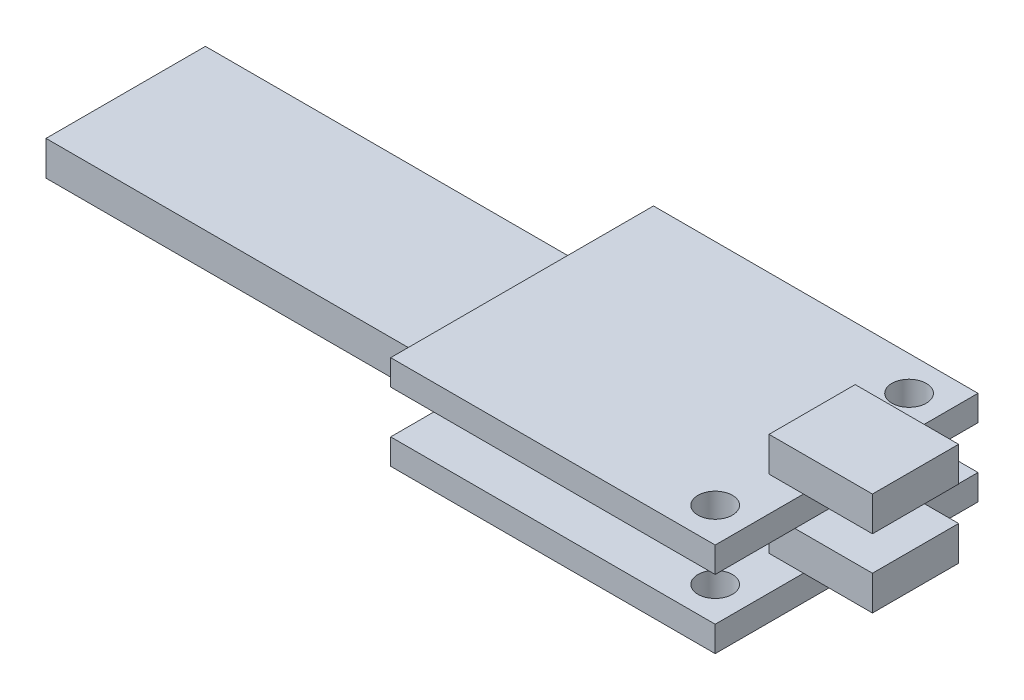
ISO-10303-21;
HEADER;
FILE_DESCRIPTION(('STEP AP214'),'2;1');
FILE_NAME('part.step','',(''),(''),'','','');
FILE_SCHEMA(('AUTOMOTIVE_DESIGN { 1 0 10303 214 1 1 1 1 }'));
ENDSEC;
DATA;
#1=APPLICATION_CONTEXT('core data for automotive mechanical design processes');
#2=APPLICATION_PROTOCOL_DEFINITION('international standard','automotive_design',2000,#1);
#3=PRODUCT_CONTEXT('',#1,'mechanical');
#4=PRODUCT('Part','Part','',(#3));
#5=PRODUCT_RELATED_PRODUCT_CATEGORY('part','',(#4));
#6=PRODUCT_DEFINITION_FORMATION('','',#4);
#7=PRODUCT_DEFINITION_CONTEXT('part definition',#1,'design');
#8=PRODUCT_DEFINITION('design','',#6,#7);
#9=PRODUCT_DEFINITION_SHAPE('','',#8);
#10=(LENGTH_UNIT() NAMED_UNIT(*) SI_UNIT(.MILLI.,.METRE.));
#11=(NAMED_UNIT(*) PLANE_ANGLE_UNIT() SI_UNIT($,.RADIAN.));
#12=(NAMED_UNIT(*) SI_UNIT($,.STERADIAN.) SOLID_ANGLE_UNIT());
#13=UNCERTAINTY_MEASURE_WITH_UNIT(LENGTH_MEASURE(1.E-05),#10,'distance_accuracy_value','');
#14=(GEOMETRIC_REPRESENTATION_CONTEXT(3) GLOBAL_UNCERTAINTY_ASSIGNED_CONTEXT((#13)) GLOBAL_UNIT_ASSIGNED_CONTEXT((#10,
#11,#12)) REPRESENTATION_CONTEXT('',''));
#15=CARTESIAN_POINT('',(0.,0.,0.));
#16=DIRECTION('',(0.,0.,1.));
#17=DIRECTION('',(1.,0.,0.));
#18=AXIS2_PLACEMENT_3D('',#15,#16,#17);
#19=CARTESIAN_POINT('',(0.,5.46,0.));
#20=DIRECTION('',(0.,0.,-1.));
#21=DIRECTION('',(-1.,0.,0.));
#22=AXIS2_PLACEMENT_3D('',#19,#20,#21);
#23=PLANE('',#22);
#24=DIRECTION('',(1.,0.,0.));
#25=VECTOR('',#24,1.);
#26=CARTESIAN_POINT('',(0.,3.98,0.));
#27=LINE('',#26,#25);
#28=CARTESIAN_POINT('',(0.,3.98,0.));
#29=VERTEX_POINT('',#28);
#30=CARTESIAN_POINT('',(18.83,3.98,0.));
#31=VERTEX_POINT('',#30);
#32=EDGE_CURVE('E135',#29,#31,#27,.T.);
#33=ORIENTED_EDGE('',*,*,#32,.T.);
#34=DIRECTION('',(0.,-1.,0.));
#35=VECTOR('',#34,1.);
#36=CARTESIAN_POINT('',(18.83,5.46,0.));
#37=LINE('',#36,#35);
#38=CARTESIAN_POINT('',(18.83,5.46,0.));
#39=VERTEX_POINT('',#38);
#40=EDGE_CURVE('E47',#39,#31,#37,.T.);
#41=ORIENTED_EDGE('',*,*,#40,.F.);
#42=DIRECTION('',(1.,0.,0.));
#43=VECTOR('',#42,1.);
#44=CARTESIAN_POINT('',(0.,5.46,0.));
#45=LINE('',#44,#43);
#46=CARTESIAN_POINT('',(0.,5.46,0.));
#47=VERTEX_POINT('',#46);
#48=EDGE_CURVE('E144',#47,#39,#45,.T.);
#49=ORIENTED_EDGE('',*,*,#48,.F.);
#50=DIRECTION('',(0.,-1.,0.));
#51=VECTOR('',#50,1.);
#52=CARTESIAN_POINT('',(0.,5.46,0.));
#53=LINE('',#52,#51);
#54=EDGE_CURVE('E162',#47,#29,#53,.T.);
#55=ORIENTED_EDGE('',*,*,#54,.T.);
#56=EDGE_LOOP('',(#33,#41,#49,#55));
#57=FACE_BOUND('',#56,.T.);
#58=ADVANCED_FACE('F44',(#57),#23,.F.);
#59=CARTESIAN_POINT('',(18.83,5.46,0.));
#60=DIRECTION('',(-1.,0.,0.));
#61=DIRECTION('',(0.,0.,1.));
#62=AXIS2_PLACEMENT_3D('',#59,#60,#61);
#63=PLANE('',#62);
#64=DIRECTION('',(0.,0.,-1.));
#65=VECTOR('',#64,1.);
#66=CARTESIAN_POINT('',(18.83,3.98,0.));
#67=LINE('',#66,#65);
#68=CARTESIAN_POINT('',(18.83,3.98,-15.25));
#69=VERTEX_POINT('',#68);
#70=EDGE_CURVE('E138',#31,#69,#67,.T.);
#71=ORIENTED_EDGE('',*,*,#70,.T.);
#72=DIRECTION('',(0.,-1.,0.));
#73=VECTOR('',#72,1.);
#74=CARTESIAN_POINT('',(18.83,5.46,-15.25));
#75=LINE('',#74,#73);
#76=CARTESIAN_POINT('',(18.83,5.46,-15.25));
#77=VERTEX_POINT('',#76);
#78=EDGE_CURVE('E178',#77,#69,#75,.T.);
#79=ORIENTED_EDGE('',*,*,#78,.F.);
#80=DIRECTION('',(0.,0.,-1.));
#81=VECTOR('',#80,1.);
#82=CARTESIAN_POINT('',(18.83,5.46,0.));
#83=LINE('',#82,#81);
#84=CARTESIAN_POINT('',(18.83,5.46,-10.125));
#85=VERTEX_POINT('',#84);
#86=EDGE_CURVE('E147',#85,#77,#83,.T.);
#87=ORIENTED_EDGE('',*,*,#86,.F.);
#88=CARTESIAN_POINT('',(18.83,5.46,-5.125));
#89=VERTEX_POINT('',#88);
#90=EDGE_CURVE('E153',#89,#85,#83,.T.);
#91=ORIENTED_EDGE('',*,*,#90,.F.);
#92=EDGE_CURVE('E149',#39,#89,#83,.T.);
#93=ORIENTED_EDGE('',*,*,#92,.F.);
#94=ORIENTED_EDGE('',*,*,#40,.T.);
#95=EDGE_LOOP('',(#71,#79,#87,#91,#93,#94));
#96=FACE_BOUND('',#95,.T.);
#97=ADVANCED_FACE('F187',(#96),#63,.F.);
#98=CARTESIAN_POINT('',(0.,5.46,-15.25));
#99=DIRECTION('',(0.,0.,1.));
#100=DIRECTION('',(1.,0.,0.));
#101=AXIS2_PLACEMENT_3D('',#98,#99,#100);
#102=PLANE('',#101);
#103=DIRECTION('',(-1.,0.,0.));
#104=VECTOR('',#103,1.);
#105=CARTESIAN_POINT('',(0.,3.98,-15.25));
#106=LINE('',#105,#104);
#107=CARTESIAN_POINT('',(0.,3.98,-15.25));
#108=VERTEX_POINT('',#107);
#109=EDGE_CURVE('E165',#69,#108,#106,.T.);
#110=ORIENTED_EDGE('',*,*,#109,.T.);
#111=DIRECTION('',(0.,-1.,0.));
#112=VECTOR('',#111,1.);
#113=CARTESIAN_POINT('',(0.,5.46,-15.25));
#114=LINE('',#113,#112);
#115=CARTESIAN_POINT('',(0.,5.46,-15.25));
#116=VERTEX_POINT('',#115);
#117=EDGE_CURVE('E176',#116,#108,#114,.T.);
#118=ORIENTED_EDGE('',*,*,#117,.F.);
#119=DIRECTION('',(-1.,0.,0.));
#120=VECTOR('',#119,1.);
#121=CARTESIAN_POINT('',(0.,5.46,-15.25));
#122=LINE('',#121,#120);
#123=EDGE_CURVE('E152',#77,#116,#122,.T.);
#124=ORIENTED_EDGE('',*,*,#123,.F.);
#125=ORIENTED_EDGE('',*,*,#78,.T.);
#126=EDGE_LOOP('',(#110,#118,#124,#125));
#127=FACE_BOUND('',#126,.T.);
#128=ADVANCED_FACE('F197',(#127),#102,.F.);
#129=CARTESIAN_POINT('',(16.83,5.46,-2.));
#130=DIRECTION('',(0.,-1.,0.));
#131=DIRECTION('',(0.,0.,-1.));
#132=AXIS2_PLACEMENT_3D('',#129,#130,#131);
#133=CYLINDRICAL_SURFACE('',#132,1.);
#134=CARTESIAN_POINT('',(16.83,5.46,-2.));
#135=DIRECTION('',(0.,1.,0.));
#136=DIRECTION('',(0.,0.,1.));
#137=AXIS2_PLACEMENT_3D('',#134,#135,#136);
#138=CIRCLE('',#137,1.);
#139=CARTESIAN_POINT('',(16.83,5.46,-0.999999999999999));
#140=VERTEX_POINT('',#139);
#141=EDGE_CURVE('E157',#140,#140,#138,.T.);
#142=ORIENTED_EDGE('',*,*,#141,.T.);
#143=EDGE_LOOP('',(#142));
#144=FACE_BOUND('',#143,.T.);
#145=CARTESIAN_POINT('',(16.83,3.98,-2.));
#146=DIRECTION('',(0.,1.,0.));
#147=DIRECTION('',(0.,0.,1.));
#148=AXIS2_PLACEMENT_3D('',#145,#146,#147);
#149=CIRCLE('',#148,1.);
#150=CARTESIAN_POINT('',(16.83,3.98,-0.999999999999999));
#151=VERTEX_POINT('',#150);
#152=EDGE_CURVE('E169',#151,#151,#149,.T.);
#153=ORIENTED_EDGE('',*,*,#152,.F.);
#154=EDGE_LOOP('',(#153));
#155=FACE_BOUND('',#154,.T.);
#156=ADVANCED_FACE('F240',(#144,#155),#133,.F.);
#157=CARTESIAN_POINT('',(0.,5.46,0.));
#158=DIRECTION('',(1.,0.,0.));
#159=DIRECTION('',(0.,0.,-1.));
#160=AXIS2_PLACEMENT_3D('',#157,#158,#159);
#161=PLANE('',#160);
#162=DIRECTION('',(0.,0.,1.));
#163=VECTOR('',#162,1.);
#164=CARTESIAN_POINT('',(0.,3.98,0.));
#165=LINE('',#164,#163);
#166=EDGE_CURVE('E167',#108,#29,#165,.T.);
#167=ORIENTED_EDGE('',*,*,#166,.T.);
#168=ORIENTED_EDGE('',*,*,#54,.F.);
#169=DIRECTION('',(0.,0.,1.));
#170=VECTOR('',#169,1.);
#171=CARTESIAN_POINT('',(0.,5.46,0.));
#172=LINE('',#171,#170);
#173=EDGE_CURVE('E155',#116,#47,#172,.T.);
#174=ORIENTED_EDGE('',*,*,#173,.F.);
#175=ORIENTED_EDGE('',*,*,#117,.T.);
#176=EDGE_LOOP('',(#167,#168,#174,#175));
#177=FACE_BOUND('',#176,.T.);
#178=ADVANCED_FACE('F200',(#177),#161,.F.);
#179=CARTESIAN_POINT('',(16.83,5.46,-13.25));
#180=DIRECTION('',(0.,-1.,0.));
#181=DIRECTION('',(0.,0.,-1.));
#182=AXIS2_PLACEMENT_3D('',#179,#180,#181);
#183=CYLINDRICAL_SURFACE('',#182,1.);
#184=CARTESIAN_POINT('',(16.83,5.46,-13.25));
#185=DIRECTION('',(0.,1.,0.));
#186=DIRECTION('',(0.,0.,1.));
#187=AXIS2_PLACEMENT_3D('',#184,#185,#186);
#188=CIRCLE('',#187,1.);
#189=CARTESIAN_POINT('',(16.83,5.46,-12.25));
#190=VERTEX_POINT('',#189);
#191=EDGE_CURVE('E160',#190,#190,#188,.T.);
#192=ORIENTED_EDGE('',*,*,#191,.T.);
#193=EDGE_LOOP('',(#192));
#194=FACE_BOUND('',#193,.T.);
#195=CARTESIAN_POINT('',(16.83,3.98,-13.25));
#196=DIRECTION('',(0.,1.,0.));
#197=DIRECTION('',(0.,0.,1.));
#198=AXIS2_PLACEMENT_3D('',#195,#196,#197);
#199=CIRCLE('',#198,1.);
#200=CARTESIAN_POINT('',(16.83,3.98,-12.25));
#201=VERTEX_POINT('',#200);
#202=EDGE_CURVE('E148',#201,#201,#199,.T.);
#203=ORIENTED_EDGE('',*,*,#202,.F.);
#204=EDGE_LOOP('',(#203));
#205=FACE_BOUND('',#204,.T.);
#206=ADVANCED_FACE('F245',(#194,#205),#183,.F.);
#207=CARTESIAN_POINT('',(0.,5.46,0.));
#208=DIRECTION('',(0.,1.,0.));
#209=DIRECTION('',(0.,0.,1.));
#210=AXIS2_PLACEMENT_3D('',#207,#208,#209);
#211=PLANE('',#210);
#212=DIRECTION('',(-1.,0.,0.));
#213=VECTOR('',#212,1.);
#214=CARTESIAN_POINT('',(22.83,5.46,-10.125));
#215=LINE('',#214,#213);
#216=CARTESIAN_POINT('',(16.83,5.46,-10.125));
#217=VERTEX_POINT('',#216);
#218=EDGE_CURVE('E12',#85,#217,#215,.T.);
#219=ORIENTED_EDGE('',*,*,#218,.F.);
#220=ORIENTED_EDGE('',*,*,#86,.T.);
#221=ORIENTED_EDGE('',*,*,#123,.T.);
#222=ORIENTED_EDGE('',*,*,#173,.T.);
#223=ORIENTED_EDGE('',*,*,#48,.T.);
#224=ORIENTED_EDGE('',*,*,#92,.T.);
#225=DIRECTION('',(1.,0.,0.));
#226=VECTOR('',#225,1.);
#227=CARTESIAN_POINT('',(16.83,5.46,-5.125));
#228=LINE('',#227,#226);
#229=CARTESIAN_POINT('',(16.83,5.46,-5.125));
#230=VERTEX_POINT('',#229);
#231=EDGE_CURVE('E216',#230,#89,#228,.T.);
#232=ORIENTED_EDGE('',*,*,#231,.F.);
#233=DIRECTION('',(0.,0.,1.));
#234=VECTOR('',#233,1.);
#235=CARTESIAN_POINT('',(16.83,5.46,-10.125));
#236=LINE('',#235,#234);
#237=EDGE_CURVE('E60',#217,#230,#236,.T.);
#238=ORIENTED_EDGE('',*,*,#237,.F.);
#239=EDGE_LOOP('',(#219,#220,#221,#222,#223,#224,#232,#238));
#240=FACE_BOUND('',#239,.T.);
#241=ORIENTED_EDGE('',*,*,#141,.F.);
#242=EDGE_LOOP('',(#241));
#243=FACE_BOUND('',#242,.T.);
#244=ORIENTED_EDGE('',*,*,#191,.F.);
#245=EDGE_LOOP('',(#244));
#246=FACE_BOUND('',#245,.T.);
#247=ADVANCED_FACE('F201',(#240,#243,#246),#211,.T.);
#248=CARTESIAN_POINT('',(0.,3.98,0.));
#249=DIRECTION('',(0.,1.,0.));
#250=DIRECTION('',(0.,0.,1.));
#251=AXIS2_PLACEMENT_3D('',#248,#249,#250);
#252=PLANE('',#251);
#253=ORIENTED_EDGE('',*,*,#32,.F.);
#254=ORIENTED_EDGE('',*,*,#166,.F.);
#255=ORIENTED_EDGE('',*,*,#109,.F.);
#256=ORIENTED_EDGE('',*,*,#70,.F.);
#257=EDGE_LOOP('',(#253,#254,#255,#256));
#258=FACE_BOUND('',#257,.T.);
#259=ORIENTED_EDGE('',*,*,#152,.T.);
#260=EDGE_LOOP('',(#259));
#261=FACE_BOUND('',#260,.T.);
#262=ORIENTED_EDGE('',*,*,#202,.T.);
#263=EDGE_LOOP('',(#262));
#264=FACE_BOUND('',#263,.T.);
#265=ADVANCED_FACE('F194',(#258,#261,#264),#252,.F.);
#266=CARTESIAN_POINT('',(0.,5.46,0.));
#267=DIRECTION('',(0.,1.,0.));
#268=DIRECTION('',(0.,0.,1.));
#269=AXIS2_PLACEMENT_3D('',#266,#267,#268);
#270=PLANE('',#269);
#271=CARTESIAN_POINT('',(22.83,5.46,-5.125));
#272=VERTEX_POINT('',#271);
#273=EDGE_CURVE('E209',#89,#272,#228,.T.);
#274=ORIENTED_EDGE('',*,*,#273,.F.);
#275=ORIENTED_EDGE('',*,*,#90,.T.);
#276=CARTESIAN_POINT('',(22.83,5.46,-10.125));
#277=VERTEX_POINT('',#276);
#278=EDGE_CURVE('E53',#277,#85,#215,.T.);
#279=ORIENTED_EDGE('',*,*,#278,.F.);
#280=DIRECTION('',(0.,0.,-1.));
#281=VECTOR('',#280,1.);
#282=CARTESIAN_POINT('',(22.83,5.46,-5.125));
#283=LINE('',#282,#281);
#284=EDGE_CURVE('E131',#272,#277,#283,.T.);
#285=ORIENTED_EDGE('',*,*,#284,.F.);
#286=EDGE_LOOP('',(#274,#275,#279,#285));
#287=FACE_BOUND('',#286,.T.);
#288=ADVANCED_FACE('F207',(#287),#270,.F.);
#289=CARTESIAN_POINT('',(22.83,7.46,-10.125));
#290=DIRECTION('',(0.,0.,1.));
#291=DIRECTION('',(1.,0.,0.));
#292=AXIS2_PLACEMENT_3D('',#289,#290,#291);
#293=PLANE('',#292);
#294=ORIENTED_EDGE('',*,*,#278,.T.);
#295=ORIENTED_EDGE('',*,*,#218,.T.);
#296=DIRECTION('',(0.,-1.,0.));
#297=VECTOR('',#296,1.);
#298=CARTESIAN_POINT('',(16.83,7.46,-10.125));
#299=LINE('',#298,#297);
#300=CARTESIAN_POINT('',(16.83,7.46,-10.125));
#301=VERTEX_POINT('',#300);
#302=EDGE_CURVE('E116',#301,#217,#299,.T.);
#303=ORIENTED_EDGE('',*,*,#302,.F.);
#304=DIRECTION('',(-1.,0.,0.));
#305=VECTOR('',#304,1.);
#306=CARTESIAN_POINT('',(22.83,7.46,-10.125));
#307=LINE('',#306,#305);
#308=CARTESIAN_POINT('',(22.83,7.46,-10.125));
#309=VERTEX_POINT('',#308);
#310=EDGE_CURVE('E122',#309,#301,#307,.T.);
#311=ORIENTED_EDGE('',*,*,#310,.F.);
#312=DIRECTION('',(0.,-1.,0.));
#313=VECTOR('',#312,1.);
#314=CARTESIAN_POINT('',(22.83,7.46,-10.125));
#315=LINE('',#314,#313);
#316=EDGE_CURVE('E211',#309,#277,#315,.T.);
#317=ORIENTED_EDGE('',*,*,#316,.T.);
#318=EDGE_LOOP('',(#294,#295,#303,#311,#317));
#319=FACE_BOUND('',#318,.T.);
#320=ADVANCED_FACE('F134',(#319),#293,.F.);
#321=CARTESIAN_POINT('',(16.83,7.46,-10.125));
#322=DIRECTION('',(1.,0.,0.));
#323=DIRECTION('',(0.,0.,-1.));
#324=AXIS2_PLACEMENT_3D('',#321,#322,#323);
#325=PLANE('',#324);
#326=ORIENTED_EDGE('',*,*,#237,.T.);
#327=DIRECTION('',(0.,-1.,0.));
#328=VECTOR('',#327,1.);
#329=CARTESIAN_POINT('',(16.83,7.46,-5.125));
#330=LINE('',#329,#328);
#331=CARTESIAN_POINT('',(16.83,7.46,-5.125));
#332=VERTEX_POINT('',#331);
#333=EDGE_CURVE('E118',#332,#230,#330,.T.);
#334=ORIENTED_EDGE('',*,*,#333,.F.);
#335=DIRECTION('',(0.,0.,1.));
#336=VECTOR('',#335,1.);
#337=CARTESIAN_POINT('',(16.83,7.46,-10.125));
#338=LINE('',#337,#336);
#339=EDGE_CURVE('E112',#301,#332,#338,.T.);
#340=ORIENTED_EDGE('',*,*,#339,.F.);
#341=ORIENTED_EDGE('',*,*,#302,.T.);
#342=EDGE_LOOP('',(#326,#334,#340,#341));
#343=FACE_BOUND('',#342,.T.);
#344=ADVANCED_FACE('F114',(#343),#325,.F.);
#345=CARTESIAN_POINT('',(16.83,7.46,-5.125));
#346=DIRECTION('',(0.,0.,-1.));
#347=DIRECTION('',(-1.,0.,0.));
#348=AXIS2_PLACEMENT_3D('',#345,#346,#347);
#349=PLANE('',#348);
#350=ORIENTED_EDGE('',*,*,#231,.T.);
#351=ORIENTED_EDGE('',*,*,#273,.T.);
#352=DIRECTION('',(0.,-1.,0.));
#353=VECTOR('',#352,1.);
#354=CARTESIAN_POINT('',(22.83,7.46,-5.125));
#355=LINE('',#354,#353);
#356=CARTESIAN_POINT('',(22.83,7.46,-5.125));
#357=VERTEX_POINT('',#356);
#358=EDGE_CURVE('E140',#357,#272,#355,.T.);
#359=ORIENTED_EDGE('',*,*,#358,.F.);
#360=DIRECTION('',(1.,0.,0.));
#361=VECTOR('',#360,1.);
#362=CARTESIAN_POINT('',(16.83,7.46,-5.125));
#363=LINE('',#362,#361);
#364=EDGE_CURVE('E121',#332,#357,#363,.T.);
#365=ORIENTED_EDGE('',*,*,#364,.F.);
#366=ORIENTED_EDGE('',*,*,#333,.T.);
#367=EDGE_LOOP('',(#350,#351,#359,#365,#366));
#368=FACE_BOUND('',#367,.T.);
#369=ADVANCED_FACE('F224',(#368),#349,.F.);
#370=CARTESIAN_POINT('',(22.83,7.46,-5.125));
#371=DIRECTION('',(-1.,0.,0.));
#372=DIRECTION('',(0.,0.,1.));
#373=AXIS2_PLACEMENT_3D('',#370,#371,#372);
#374=PLANE('',#373);
#375=ORIENTED_EDGE('',*,*,#284,.T.);
#376=ORIENTED_EDGE('',*,*,#316,.F.);
#377=DIRECTION('',(0.,0.,-1.));
#378=VECTOR('',#377,1.);
#379=CARTESIAN_POINT('',(22.83,7.46,-5.125));
#380=LINE('',#379,#378);
#381=EDGE_CURVE('E127',#357,#309,#380,.T.);
#382=ORIENTED_EDGE('',*,*,#381,.F.);
#383=ORIENTED_EDGE('',*,*,#358,.T.);
#384=EDGE_LOOP('',(#375,#376,#382,#383));
#385=FACE_BOUND('',#384,.T.);
#386=ADVANCED_FACE('F222',(#385),#374,.F.);
#387=CARTESIAN_POINT('',(0.,7.46,0.));
#388=DIRECTION('',(0.,1.,0.));
#389=DIRECTION('',(0.,0.,1.));
#390=AXIS2_PLACEMENT_3D('',#387,#388,#389);
#391=PLANE('',#390);
#392=ORIENTED_EDGE('',*,*,#310,.T.);
#393=ORIENTED_EDGE('',*,*,#339,.T.);
#394=ORIENTED_EDGE('',*,*,#364,.T.);
#395=ORIENTED_EDGE('',*,*,#381,.T.);
#396=EDGE_LOOP('',(#392,#393,#394,#395));
#397=FACE_BOUND('',#396,.T.);
#398=ADVANCED_FACE('F125',(#397),#391,.T.);
#399=CLOSED_SHELL('',(#58,#97,#128,#156,#178,#206,#247,#265,#288,#320,#344,#369,#386,#398));
#400=MANIFOLD_SOLID_BREP('B2',#399);
#401=CARTESIAN_POINT('',(0.,1.48,0.));
#402=DIRECTION('',(1.,0.,0.));
#403=DIRECTION('',(0.,0.,-1.));
#404=AXIS2_PLACEMENT_3D('',#401,#402,#403);
#405=PLANE('',#404);
#406=DIRECTION('',(0.,0.,1.));
#407=VECTOR('',#406,1.);
#408=CARTESIAN_POINT('',(0.,1.48,-3.));
#409=LINE('',#408,#407);
#410=CARTESIAN_POINT('',(0.,1.48,-12.25));
#411=VERTEX_POINT('',#410);
#412=CARTESIAN_POINT('',(0.,1.48,-3.));
#413=VERTEX_POINT('',#412);
#414=EDGE_CURVE('E485',#411,#413,#409,.T.);
#415=ORIENTED_EDGE('',*,*,#414,.F.);
#416=DIRECTION('',(0.,0.,1.));
#417=VECTOR('',#416,1.);
#418=CARTESIAN_POINT('',(0.,1.48,0.));
#419=LINE('',#418,#417);
#420=CARTESIAN_POINT('',(0.,1.48,-15.25));
#421=VERTEX_POINT('',#420);
#422=EDGE_CURVE('E560',#421,#411,#419,.T.);
#423=ORIENTED_EDGE('',*,*,#422,.F.);
#424=DIRECTION('',(0.,-1.,0.));
#425=VECTOR('',#424,1.);
#426=CARTESIAN_POINT('',(0.,1.48,-15.25));
#427=LINE('',#426,#425);
#428=CARTESIAN_POINT('',(0.,0.,-15.25));
#429=VERTEX_POINT('',#428);
#430=EDGE_CURVE('E571',#421,#429,#427,.T.);
#431=ORIENTED_EDGE('',*,*,#430,.T.);
#432=DIRECTION('',(0.,0.,1.));
#433=VECTOR('',#432,1.);
#434=CARTESIAN_POINT('',(0.,0.,0.));
#435=LINE('',#434,#433);
#436=CARTESIAN_POINT('',(0.,0.,0.));
#437=VERTEX_POINT('',#436);
#438=EDGE_CURVE('E557',#429,#437,#435,.T.);
#439=ORIENTED_EDGE('',*,*,#438,.T.);
#440=DIRECTION('',(0.,-1.,0.));
#441=VECTOR('',#440,1.);
#442=CARTESIAN_POINT('',(0.,1.48,0.));
#443=LINE('',#442,#441);
#444=CARTESIAN_POINT('',(0.,1.48,0.));
#445=VERTEX_POINT('',#444);
#446=EDGE_CURVE('E587',#445,#437,#443,.T.);
#447=ORIENTED_EDGE('',*,*,#446,.F.);
#448=EDGE_CURVE('E563',#413,#445,#419,.T.);
#449=ORIENTED_EDGE('',*,*,#448,.F.);
#450=EDGE_LOOP('',(#415,#423,#431,#439,#447,#449));
#451=FACE_BOUND('',#450,.T.);
#452=ADVANCED_FACE('F361',(#451),#405,.F.);
#453=CARTESIAN_POINT('',(0.,1.48,0.));
#454=DIRECTION('',(0.,-1.,0.));
#455=DIRECTION('',(0.,0.,-1.));
#456=AXIS2_PLACEMENT_3D('',#453,#454,#455);
#457=PLANE('',#456);
#458=CARTESIAN_POINT('',(16.83,1.48,-13.25));
#459=DIRECTION('',(0.,1.,0.));
#460=DIRECTION('',(0.,0.,1.));
#461=AXIS2_PLACEMENT_3D('',#458,#459,#460);
#462=CIRCLE('',#461,1.);
#463=CARTESIAN_POINT('',(16.83,1.48,-12.25));
#464=VERTEX_POINT('',#463);
#465=EDGE_CURVE('E554',#464,#464,#462,.T.);
#466=ORIENTED_EDGE('',*,*,#465,.F.);
#467=EDGE_LOOP('',(#466));
#468=FACE_BOUND('',#467,.T.);
#469=CARTESIAN_POINT('',(16.83,1.48,-2.));
#470=DIRECTION('',(0.,1.,0.));
#471=DIRECTION('',(0.,0.,1.));
#472=AXIS2_PLACEMENT_3D('',#469,#470,#471);
#473=CIRCLE('',#472,1.);
#474=CARTESIAN_POINT('',(16.83,1.48,-0.999999999999999));
#475=VERTEX_POINT('',#474);
#476=EDGE_CURVE('E548',#475,#475,#473,.T.);
#477=ORIENTED_EDGE('',*,*,#476,.F.);
#478=EDGE_LOOP('',(#477));
#479=FACE_BOUND('',#478,.T.);
#480=CARTESIAN_POINT('',(9.41499999999999,1.48,-7.625));
#481=DIRECTION('',(0.,-1.,0.));
#482=DIRECTION('',(0.,0.,-1.));
#483=AXIS2_PLACEMENT_3D('',#480,#481,#482);
#484=CIRCLE('',#483,0.901743865831861);
#485=CARTESIAN_POINT('',(9.41499999999999,1.48,-8.52674386583186));
#486=VERTEX_POINT('',#485);
#487=EDGE_CURVE('E42',#486,#486,#484,.F.);
#488=ORIENTED_EDGE('',*,*,#487,.F.);
#489=EDGE_LOOP('',(#488));
#490=FACE_BOUND('',#489,.T.);
#491=DIRECTION('',(1.,0.,0.));
#492=VECTOR('',#491,1.);
#493=CARTESIAN_POINT('',(0.,1.48,-3.));
#494=LINE('',#493,#492);
#495=CARTESIAN_POINT('',(1.99999999999999,1.48,-3.));
#496=VERTEX_POINT('',#495);
#497=EDGE_CURVE('E500',#413,#496,#494,.T.);
#498=ORIENTED_EDGE('',*,*,#497,.F.);
#499=ORIENTED_EDGE('',*,*,#448,.T.);
#500=DIRECTION('',(1.,0.,0.));
#501=VECTOR('',#500,1.);
#502=CARTESIAN_POINT('',(0.,1.48,0.));
#503=LINE('',#502,#501);
#504=CARTESIAN_POINT('',(18.83,1.48,0.));
#505=VERTEX_POINT('',#504);
#506=EDGE_CURVE('E562',#445,#505,#503,.T.);
#507=ORIENTED_EDGE('',*,*,#506,.T.);
#508=DIRECTION('',(0.,0.,-1.));
#509=VECTOR('',#508,1.);
#510=CARTESIAN_POINT('',(18.83,1.48,0.));
#511=LINE('',#510,#509);
#512=CARTESIAN_POINT('',(18.83,1.48,-5.125));
#513=VERTEX_POINT('',#512);
#514=EDGE_CURVE('E566',#505,#513,#511,.T.);
#515=ORIENTED_EDGE('',*,*,#514,.T.);
#516=DIRECTION('',(1.,0.,0.));
#517=VECTOR('',#516,1.);
#518=CARTESIAN_POINT('',(16.83,1.48,-5.125));
#519=LINE('',#518,#517);
#520=CARTESIAN_POINT('',(16.83,1.48,-5.125));
#521=VERTEX_POINT('',#520);
#522=EDGE_CURVE('E529',#521,#513,#519,.T.);
#523=ORIENTED_EDGE('',*,*,#522,.F.);
#524=DIRECTION('',(0.,0.,1.));
#525=VECTOR('',#524,1.);
#526=CARTESIAN_POINT('',(16.83,1.48,-10.125));
#527=LINE('',#526,#525);
#528=CARTESIAN_POINT('',(16.83,1.48,-10.125));
#529=VERTEX_POINT('',#528);
#530=EDGE_CURVE('E514',#529,#521,#527,.T.);
#531=ORIENTED_EDGE('',*,*,#530,.F.);
#532=DIRECTION('',(-1.,0.,0.));
#533=VECTOR('',#532,1.);
#534=CARTESIAN_POINT('',(16.83,1.48,-10.125));
#535=LINE('',#534,#533);
#536=CARTESIAN_POINT('',(18.83,1.48,-10.125));
#537=VERTEX_POINT('',#536);
#538=EDGE_CURVE('E368',#537,#529,#535,.T.);
#539=ORIENTED_EDGE('',*,*,#538,.F.);
#540=CARTESIAN_POINT('',(18.83,1.48,-15.25));
#541=VERTEX_POINT('',#540);
#542=EDGE_CURVE('E565',#537,#541,#511,.T.);
#543=ORIENTED_EDGE('',*,*,#542,.T.);
#544=DIRECTION('',(-1.,0.,0.));
#545=VECTOR('',#544,1.);
#546=CARTESIAN_POINT('',(0.,1.48,-15.25));
#547=LINE('',#546,#545);
#548=EDGE_CURVE('E568',#541,#421,#547,.T.);
#549=ORIENTED_EDGE('',*,*,#548,.T.);
#550=ORIENTED_EDGE('',*,*,#422,.T.);
#551=DIRECTION('',(-1.,0.,0.));
#552=VECTOR('',#551,1.);
#553=CARTESIAN_POINT('',(0.,1.48,-12.25));
#554=LINE('',#553,#552);
#555=CARTESIAN_POINT('',(1.99999999999999,1.48,-12.25));
#556=VERTEX_POINT('',#555);
#557=EDGE_CURVE('E380',#556,#411,#554,.T.);
#558=ORIENTED_EDGE('',*,*,#557,.F.);
#559=DIRECTION('',(0.,0.,-1.));
#560=VECTOR('',#559,1.);
#561=CARTESIAN_POINT('',(1.99999999999999,1.48,-12.25));
#562=LINE('',#561,#560);
#563=EDGE_CURVE('E375',#496,#556,#562,.T.);
#564=ORIENTED_EDGE('',*,*,#563,.F.);
#565=EDGE_LOOP('',(#498,#499,#507,#515,#523,#531,#539,#543,#549,#550,#558,#564));
#566=FACE_BOUND('',#565,.T.);
#567=ADVANCED_FACE('F618',(#468,#479,#490,#566),#457,.F.);
#568=CARTESIAN_POINT('',(0.,0.,0.));
#569=DIRECTION('',(0.,-1.,0.));
#570=DIRECTION('',(0.,0.,-1.));
#571=AXIS2_PLACEMENT_3D('',#568,#569,#570);
#572=PLANE('',#571);
#573=CARTESIAN_POINT('',(8.83,0.,-7.625));
#574=DIRECTION('',(0.,-1.,0.));
#575=DIRECTION('',(0.,0.,-1.));
#576=AXIS2_PLACEMENT_3D('',#573,#574,#575);
#577=CIRCLE('',#576,1.5);
#578=CARTESIAN_POINT('',(8.83,0.,-9.125));
#579=VERTEX_POINT('',#578);
#580=EDGE_CURVE('E491',#579,#579,#577,.T.);
#581=ORIENTED_EDGE('',*,*,#580,.F.);
#582=EDGE_LOOP('',(#581));
#583=FACE_BOUND('',#582,.T.);
#584=CARTESIAN_POINT('',(16.83,0.,-13.25));
#585=DIRECTION('',(0.,1.,0.));
#586=DIRECTION('',(0.,0.,1.));
#587=AXIS2_PLACEMENT_3D('',#584,#585,#586);
#588=CIRCLE('',#587,1.);
#589=CARTESIAN_POINT('',(16.83,0.,-12.25));
#590=VERTEX_POINT('',#589);
#591=EDGE_CURVE('E551',#590,#590,#588,.T.);
#592=ORIENTED_EDGE('',*,*,#591,.T.);
#593=EDGE_LOOP('',(#592));
#594=FACE_BOUND('',#593,.T.);
#595=ORIENTED_EDGE('',*,*,#438,.F.);
#596=DIRECTION('',(-1.,0.,0.));
#597=VECTOR('',#596,1.);
#598=CARTESIAN_POINT('',(0.,0.,-15.25));
#599=LINE('',#598,#597);
#600=CARTESIAN_POINT('',(18.83,0.,-15.25));
#601=VERTEX_POINT('',#600);
#602=EDGE_CURVE('E578',#601,#429,#599,.T.);
#603=ORIENTED_EDGE('',*,*,#602,.F.);
#604=DIRECTION('',(0.,0.,-1.));
#605=VECTOR('',#604,1.);
#606=CARTESIAN_POINT('',(18.83,0.,0.));
#607=LINE('',#606,#605);
#608=CARTESIAN_POINT('',(18.83,0.,0.));
#609=VERTEX_POINT('',#608);
#610=EDGE_CURVE('E576',#609,#601,#607,.T.);
#611=ORIENTED_EDGE('',*,*,#610,.F.);
#612=DIRECTION('',(1.,0.,0.));
#613=VECTOR('',#612,1.);
#614=CARTESIAN_POINT('',(0.,0.,0.));
#615=LINE('',#614,#613);
#616=EDGE_CURVE('E574',#437,#609,#615,.T.);
#617=ORIENTED_EDGE('',*,*,#616,.F.);
#618=EDGE_LOOP('',(#595,#603,#611,#617));
#619=FACE_BOUND('',#618,.T.);
#620=CARTESIAN_POINT('',(16.83,0.,-2.));
#621=DIRECTION('',(0.,1.,0.));
#622=DIRECTION('',(0.,0.,1.));
#623=AXIS2_PLACEMENT_3D('',#620,#621,#622);
#624=CIRCLE('',#623,1.);
#625=CARTESIAN_POINT('',(16.83,0.,-0.999999999999999));
#626=VERTEX_POINT('',#625);
#627=EDGE_CURVE('E547',#626,#626,#624,.T.);
#628=ORIENTED_EDGE('',*,*,#627,.T.);
#629=EDGE_LOOP('',(#628));
#630=FACE_BOUND('',#629,.T.);
#631=ADVANCED_FACE('F651',(#583,#594,#619,#630),#572,.T.);
#632=CARTESIAN_POINT('',(0.,1.48,0.));
#633=DIRECTION('',(0.,0.,-1.));
#634=DIRECTION('',(-1.,0.,0.));
#635=AXIS2_PLACEMENT_3D('',#632,#633,#634);
#636=PLANE('',#635);
#637=ORIENTED_EDGE('',*,*,#616,.T.);
#638=DIRECTION('',(0.,-1.,0.));
#639=VECTOR('',#638,1.);
#640=CARTESIAN_POINT('',(18.83,1.48,0.));
#641=LINE('',#640,#639);
#642=EDGE_CURVE('E585',#505,#609,#641,.T.);
#643=ORIENTED_EDGE('',*,*,#642,.F.);
#644=ORIENTED_EDGE('',*,*,#506,.F.);
#645=ORIENTED_EDGE('',*,*,#446,.T.);
#646=EDGE_LOOP('',(#637,#643,#644,#645));
#647=FACE_BOUND('',#646,.T.);
#648=ADVANCED_FACE('F657',(#647),#636,.F.);
#649=CARTESIAN_POINT('',(18.83,1.48,0.));
#650=DIRECTION('',(-1.,0.,0.));
#651=DIRECTION('',(0.,0.,1.));
#652=AXIS2_PLACEMENT_3D('',#649,#650,#651);
#653=PLANE('',#652);
#654=ORIENTED_EDGE('',*,*,#610,.T.);
#655=DIRECTION('',(0.,-1.,0.));
#656=VECTOR('',#655,1.);
#657=CARTESIAN_POINT('',(18.83,1.48,-15.25));
#658=LINE('',#657,#656);
#659=EDGE_CURVE('E582',#541,#601,#658,.T.);
#660=ORIENTED_EDGE('',*,*,#659,.F.);
#661=ORIENTED_EDGE('',*,*,#542,.F.);
#662=EDGE_CURVE('E569',#513,#537,#511,.T.);
#663=ORIENTED_EDGE('',*,*,#662,.F.);
#664=ORIENTED_EDGE('',*,*,#514,.F.);
#665=ORIENTED_EDGE('',*,*,#642,.T.);
#666=EDGE_LOOP('',(#654,#660,#661,#663,#664,#665));
#667=FACE_BOUND('',#666,.T.);
#668=ADVANCED_FACE('F621',(#667),#653,.F.);
#669=CARTESIAN_POINT('',(0.,1.48,-15.25));
#670=DIRECTION('',(0.,0.,1.));
#671=DIRECTION('',(1.,0.,0.));
#672=AXIS2_PLACEMENT_3D('',#669,#670,#671);
#673=PLANE('',#672);
#674=ORIENTED_EDGE('',*,*,#602,.T.);
#675=ORIENTED_EDGE('',*,*,#430,.F.);
#676=ORIENTED_EDGE('',*,*,#548,.F.);
#677=ORIENTED_EDGE('',*,*,#659,.T.);
#678=EDGE_LOOP('',(#674,#675,#676,#677));
#679=FACE_BOUND('',#678,.T.);
#680=ADVANCED_FACE('F625',(#679),#673,.F.);
#681=CARTESIAN_POINT('',(16.83,1.48,-13.25));
#682=DIRECTION('',(0.,-1.,0.));
#683=DIRECTION('',(0.,0.,-1.));
#684=AXIS2_PLACEMENT_3D('',#681,#682,#683);
#685=CYLINDRICAL_SURFACE('',#684,1.);
#686=ORIENTED_EDGE('',*,*,#465,.T.);
#687=EDGE_LOOP('',(#686));
#688=FACE_BOUND('',#687,.T.);
#689=ORIENTED_EDGE('',*,*,#591,.F.);
#690=EDGE_LOOP('',(#689));
#691=FACE_BOUND('',#690,.T.);
#692=ADVANCED_FACE('F663',(#688,#691),#685,.F.);
#693=CARTESIAN_POINT('',(16.83,1.48,-2.));
#694=DIRECTION('',(0.,-1.,0.));
#695=DIRECTION('',(0.,0.,-1.));
#696=AXIS2_PLACEMENT_3D('',#693,#694,#695);
#697=CYLINDRICAL_SURFACE('',#696,1.);
#698=ORIENTED_EDGE('',*,*,#476,.T.);
#699=EDGE_LOOP('',(#698));
#700=FACE_BOUND('',#699,.T.);
#701=ORIENTED_EDGE('',*,*,#627,.F.);
#702=EDGE_LOOP('',(#701));
#703=FACE_BOUND('',#702,.T.);
#704=ADVANCED_FACE('F689',(#700,#703),#697,.F.);
#705=CARTESIAN_POINT('',(0.,1.48,0.));
#706=DIRECTION('',(0.,1.,0.));
#707=DIRECTION('',(0.,0.,1.));
#708=AXIS2_PLACEMENT_3D('',#705,#706,#707);
#709=PLANE('',#708);
#710=CARTESIAN_POINT('',(22.83,1.48,-5.125));
#711=VERTEX_POINT('',#710);
#712=EDGE_CURVE('E528',#513,#711,#519,.T.);
#713=ORIENTED_EDGE('',*,*,#712,.F.);
#714=ORIENTED_EDGE('',*,*,#662,.T.);
#715=CARTESIAN_POINT('',(22.83,1.48,-10.125));
#716=VERTEX_POINT('',#715);
#717=EDGE_CURVE('E519',#716,#537,#535,.T.);
#718=ORIENTED_EDGE('',*,*,#717,.F.);
#719=DIRECTION('',(0.,0.,-1.));
#720=VECTOR('',#719,1.);
#721=CARTESIAN_POINT('',(22.83,1.48,-10.125));
#722=LINE('',#721,#720);
#723=EDGE_CURVE('E532',#711,#716,#722,.T.);
#724=ORIENTED_EDGE('',*,*,#723,.F.);
#725=EDGE_LOOP('',(#713,#714,#718,#724));
#726=FACE_BOUND('',#725,.T.);
#727=ADVANCED_FACE('F613',(#726),#709,.F.);
#728=CARTESIAN_POINT('',(16.83,3.48,-10.125));
#729=DIRECTION('',(1.,0.,0.));
#730=DIRECTION('',(0.,0.,-1.));
#731=AXIS2_PLACEMENT_3D('',#728,#729,#730);
#732=PLANE('',#731);
#733=ORIENTED_EDGE('',*,*,#530,.T.);
#734=DIRECTION('',(0.,-1.,0.));
#735=VECTOR('',#734,1.);
#736=CARTESIAN_POINT('',(16.83,3.48,-5.125));
#737=LINE('',#736,#735);
#738=CARTESIAN_POINT('',(16.83,3.48,-5.125));
#739=VERTEX_POINT('',#738);
#740=EDGE_CURVE('E544',#739,#521,#737,.T.);
#741=ORIENTED_EDGE('',*,*,#740,.F.);
#742=DIRECTION('',(0.,0.,1.));
#743=VECTOR('',#742,1.);
#744=CARTESIAN_POINT('',(16.83,3.48,-10.125));
#745=LINE('',#744,#743);
#746=CARTESIAN_POINT('',(16.83,3.48,-10.125));
#747=VERTEX_POINT('',#746);
#748=EDGE_CURVE('E515',#747,#739,#745,.T.);
#749=ORIENTED_EDGE('',*,*,#748,.F.);
#750=DIRECTION('',(0.,-1.,0.));
#751=VECTOR('',#750,1.);
#752=CARTESIAN_POINT('',(16.83,3.48,-10.125));
#753=LINE('',#752,#751);
#754=EDGE_CURVE('E525',#747,#529,#753,.T.);
#755=ORIENTED_EDGE('',*,*,#754,.T.);
#756=EDGE_LOOP('',(#733,#741,#749,#755));
#757=FACE_BOUND('',#756,.T.);
#758=ADVANCED_FACE('F601',(#757),#732,.F.);
#759=CARTESIAN_POINT('',(16.83,3.48,-5.125));
#760=DIRECTION('',(0.,0.,-1.));
#761=DIRECTION('',(-1.,0.,0.));
#762=AXIS2_PLACEMENT_3D('',#759,#760,#761);
#763=PLANE('',#762);
#764=ORIENTED_EDGE('',*,*,#522,.T.);
#765=ORIENTED_EDGE('',*,*,#712,.T.);
#766=DIRECTION('',(0.,-1.,0.));
#767=VECTOR('',#766,1.);
#768=CARTESIAN_POINT('',(22.83,3.48,-5.125));
#769=LINE('',#768,#767);
#770=CARTESIAN_POINT('',(22.83,3.48,-5.125));
#771=VERTEX_POINT('',#770);
#772=EDGE_CURVE('E541',#771,#711,#769,.T.);
#773=ORIENTED_EDGE('',*,*,#772,.F.);
#774=DIRECTION('',(1.,0.,0.));
#775=VECTOR('',#774,1.);
#776=CARTESIAN_POINT('',(16.83,3.48,-5.125));
#777=LINE('',#776,#775);
#778=EDGE_CURVE('E518',#739,#771,#777,.T.);
#779=ORIENTED_EDGE('',*,*,#778,.F.);
#780=ORIENTED_EDGE('',*,*,#740,.T.);
#781=EDGE_LOOP('',(#764,#765,#773,#779,#780));
#782=FACE_BOUND('',#781,.T.);
#783=ADVANCED_FACE('F676',(#782),#763,.F.);
#784=CARTESIAN_POINT('',(22.83,3.48,-10.125));
#785=DIRECTION('',(-1.,0.,0.));
#786=DIRECTION('',(0.,0.,1.));
#787=AXIS2_PLACEMENT_3D('',#784,#785,#786);
#788=PLANE('',#787);
#789=ORIENTED_EDGE('',*,*,#723,.T.);
#790=DIRECTION('',(0.,-1.,0.));
#791=VECTOR('',#790,1.);
#792=CARTESIAN_POINT('',(22.83,3.48,-10.125));
#793=LINE('',#792,#791);
#794=CARTESIAN_POINT('',(22.83,3.48,-10.125));
#795=VERTEX_POINT('',#794);
#796=EDGE_CURVE('E538',#795,#716,#793,.T.);
#797=ORIENTED_EDGE('',*,*,#796,.F.);
#798=DIRECTION('',(0.,0.,-1.));
#799=VECTOR('',#798,1.);
#800=CARTESIAN_POINT('',(22.83,3.48,-10.125));
#801=LINE('',#800,#799);
#802=EDGE_CURVE('E521',#771,#795,#801,.T.);
#803=ORIENTED_EDGE('',*,*,#802,.F.);
#804=ORIENTED_EDGE('',*,*,#772,.T.);
#805=EDGE_LOOP('',(#789,#797,#803,#804));
#806=FACE_BOUND('',#805,.T.);
#807=ADVANCED_FACE('F677',(#806),#788,.F.);
#808=CARTESIAN_POINT('',(16.83,3.48,-10.125));
#809=DIRECTION('',(0.,0.,1.));
#810=DIRECTION('',(1.,0.,0.));
#811=AXIS2_PLACEMENT_3D('',#808,#809,#810);
#812=PLANE('',#811);
#813=ORIENTED_EDGE('',*,*,#717,.T.);
#814=ORIENTED_EDGE('',*,*,#538,.T.);
#815=ORIENTED_EDGE('',*,*,#754,.F.);
#816=DIRECTION('',(-1.,0.,0.));
#817=VECTOR('',#816,1.);
#818=CARTESIAN_POINT('',(16.83,3.48,-10.125));
#819=LINE('',#818,#817);
#820=EDGE_CURVE('E523',#795,#747,#819,.T.);
#821=ORIENTED_EDGE('',*,*,#820,.F.);
#822=ORIENTED_EDGE('',*,*,#796,.T.);
#823=EDGE_LOOP('',(#813,#814,#815,#821,#822));
#824=FACE_BOUND('',#823,.T.);
#825=ADVANCED_FACE('F595',(#824),#812,.F.);
#826=CARTESIAN_POINT('',(0.,3.48,0.));
#827=DIRECTION('',(0.,1.,0.));
#828=DIRECTION('',(0.,0.,1.));
#829=AXIS2_PLACEMENT_3D('',#826,#827,#828);
#830=PLANE('',#829);
#831=ORIENTED_EDGE('',*,*,#748,.T.);
#832=ORIENTED_EDGE('',*,*,#778,.T.);
#833=ORIENTED_EDGE('',*,*,#802,.T.);
#834=ORIENTED_EDGE('',*,*,#820,.T.);
#835=EDGE_LOOP('',(#831,#832,#833,#834));
#836=FACE_BOUND('',#835,.T.);
#837=ADVANCED_FACE('F604',(#836),#830,.T.);
#838=CARTESIAN_POINT('',(9.41499999999999,3.98,-7.625));
#839=DIRECTION('',(0.,-1.,0.));
#840=DIRECTION('',(0.,0.,-1.));
#841=AXIS2_PLACEMENT_3D('',#838,#839,#840);
#842=CYLINDRICAL_SURFACE('',#841,0.901743865831861);
#843=CARTESIAN_POINT('',(9.41499999999999,3.98,-7.625));
#844=DIRECTION('',(0.,1.,0.));
#845=DIRECTION('',(0.,0.,1.));
#846=AXIS2_PLACEMENT_3D('',#843,#844,#845);
#847=CIRCLE('',#846,0.901743865831861);
#848=CARTESIAN_POINT('',(9.41499999999999,3.98,-6.72325613416814));
#849=VERTEX_POINT('',#848);
#850=EDGE_CURVE('E511',#849,#849,#847,.T.);
#851=ORIENTED_EDGE('',*,*,#850,.F.);
#852=EDGE_LOOP('',(#851));
#853=FACE_BOUND('',#852,.T.);
#854=ORIENTED_EDGE('',*,*,#487,.T.);
#855=EDGE_LOOP('',(#854));
#856=FACE_BOUND('',#855,.T.);
#857=ADVANCED_FACE('F703',(#853,#856),#842,.T.);
#858=CARTESIAN_POINT('',(9.41499999999999,3.98,-7.625));
#859=DIRECTION('',(0.,1.,0.));
#860=DIRECTION('',(0.,0.,1.));
#861=AXIS2_PLACEMENT_3D('',#858,#859,#860);
#862=PLANE('',#861);
#863=ORIENTED_EDGE('',*,*,#850,.T.);
#864=EDGE_LOOP('',(#863));
#865=FACE_BOUND('',#864,.T.);
#866=ADVANCED_FACE('F645',(#865),#862,.T.);
#867=CARTESIAN_POINT('',(0.,3.48,-3.));
#868=DIRECTION('',(0.,0.,-1.));
#869=DIRECTION('',(-1.,0.,0.));
#870=AXIS2_PLACEMENT_3D('',#867,#868,#869);
#871=PLANE('',#870);
#872=ORIENTED_EDGE('',*,*,#497,.T.);
#873=DIRECTION('',(0.,-1.,0.));
#874=VECTOR('',#873,1.);
#875=CARTESIAN_POINT('',(1.99999999999999,3.48,-3.));
#876=LINE('',#875,#874);
#877=CARTESIAN_POINT('',(1.99999999999999,3.48,-3.));
#878=VERTEX_POINT('',#877);
#879=EDGE_CURVE('E467',#878,#496,#876,.T.);
#880=ORIENTED_EDGE('',*,*,#879,.F.);
#881=DIRECTION('',(1.,0.,0.));
#882=VECTOR('',#881,1.);
#883=CARTESIAN_POINT('',(0.,3.48,-3.));
#884=LINE('',#883,#882);
#885=CARTESIAN_POINT('',(-23.,3.48,-2.99999999999999));
#886=VERTEX_POINT('',#885);
#887=EDGE_CURVE('E460',#886,#878,#884,.T.);
#888=ORIENTED_EDGE('',*,*,#887,.F.);
#889=DIRECTION('',(0.,1.,0.));
#890=VECTOR('',#889,1.);
#891=CARTESIAN_POINT('',(-23.,3.48,-2.99999999999999));
#892=LINE('',#891,#890);
#893=CARTESIAN_POINT('',(-23.,1.48,-2.99999999999999));
#894=VERTEX_POINT('',#893);
#895=EDGE_CURVE('E465',#894,#886,#892,.T.);
#896=ORIENTED_EDGE('',*,*,#895,.F.);
#897=DIRECTION('',(1.,0.,0.));
#898=VECTOR('',#897,1.);
#899=CARTESIAN_POINT('',(-23.,1.48,-2.99999999999999));
#900=LINE('',#899,#898);
#901=EDGE_CURVE('E495',#894,#413,#900,.T.);
#902=ORIENTED_EDGE('',*,*,#901,.T.);
#903=EDGE_LOOP('',(#872,#880,#888,#896,#902));
#904=FACE_BOUND('',#903,.T.);
#905=ADVANCED_FACE('F462',(#904),#871,.F.);
#906=CARTESIAN_POINT('',(1.99999999999999,3.48,-12.25));
#907=DIRECTION('',(-1.,0.,0.));
#908=DIRECTION('',(0.,0.,1.));
#909=AXIS2_PLACEMENT_3D('',#906,#907,#908);
#910=PLANE('',#909);
#911=ORIENTED_EDGE('',*,*,#563,.T.);
#912=DIRECTION('',(0.,-1.,0.));
#913=VECTOR('',#912,1.);
#914=CARTESIAN_POINT('',(1.99999999999999,3.48,-12.25));
#915=LINE('',#914,#913);
#916=CARTESIAN_POINT('',(1.99999999999999,3.48,-12.25));
#917=VERTEX_POINT('',#916);
#918=EDGE_CURVE('E504',#917,#556,#915,.T.);
#919=ORIENTED_EDGE('',*,*,#918,.F.);
#920=DIRECTION('',(0.,0.,-1.));
#921=VECTOR('',#920,1.);
#922=CARTESIAN_POINT('',(1.99999999999999,3.48,-12.25));
#923=LINE('',#922,#921);
#924=EDGE_CURVE('E470',#878,#917,#923,.T.);
#925=ORIENTED_EDGE('',*,*,#924,.F.);
#926=ORIENTED_EDGE('',*,*,#879,.T.);
#927=EDGE_LOOP('',(#911,#919,#925,#926));
#928=FACE_BOUND('',#927,.T.);
#929=ADVANCED_FACE('F637',(#928),#910,.F.);
#930=CARTESIAN_POINT('',(0.,3.48,-12.25));
#931=DIRECTION('',(0.,0.,1.));
#932=DIRECTION('',(1.,0.,0.));
#933=AXIS2_PLACEMENT_3D('',#930,#931,#932);
#934=PLANE('',#933);
#935=ORIENTED_EDGE('',*,*,#557,.T.);
#936=DIRECTION('',(1.,0.,0.));
#937=VECTOR('',#936,1.);
#938=CARTESIAN_POINT('',(-23.,1.48,-12.25));
#939=LINE('',#938,#937);
#940=CARTESIAN_POINT('',(-23.,1.48,-12.25));
#941=VERTEX_POINT('',#940);
#942=EDGE_CURVE('E498',#941,#411,#939,.T.);
#943=ORIENTED_EDGE('',*,*,#942,.F.);
#944=DIRECTION('',(0.,-1.,0.));
#945=VECTOR('',#944,1.);
#946=CARTESIAN_POINT('',(-23.,3.48,-12.25));
#947=LINE('',#946,#945);
#948=CARTESIAN_POINT('',(-23.,3.48,-12.25));
#949=VERTEX_POINT('',#948);
#950=EDGE_CURVE('E479',#949,#941,#947,.T.);
#951=ORIENTED_EDGE('',*,*,#950,.F.);
#952=DIRECTION('',(-1.,0.,0.));
#953=VECTOR('',#952,1.);
#954=CARTESIAN_POINT('',(0.,3.48,-12.25));
#955=LINE('',#954,#953);
#956=EDGE_CURVE('E476',#917,#949,#955,.T.);
#957=ORIENTED_EDGE('',*,*,#956,.F.);
#958=ORIENTED_EDGE('',*,*,#918,.T.);
#959=EDGE_LOOP('',(#935,#943,#951,#957,#958));
#960=FACE_BOUND('',#959,.T.);
#961=ADVANCED_FACE('F632',(#960),#934,.F.);
#962=CARTESIAN_POINT('',(0.,3.48,0.));
#963=DIRECTION('',(0.,1.,0.));
#964=DIRECTION('',(0.,0.,1.));
#965=AXIS2_PLACEMENT_3D('',#962,#963,#964);
#966=PLANE('',#965);
#967=ORIENTED_EDGE('',*,*,#956,.T.);
#968=DIRECTION('',(0.,0.,-1.));
#969=VECTOR('',#968,1.);
#970=CARTESIAN_POINT('',(-23.,3.48,-2.99999999999999));
#971=LINE('',#970,#969);
#972=EDGE_CURVE('E473',#886,#949,#971,.T.);
#973=ORIENTED_EDGE('',*,*,#972,.F.);
#974=ORIENTED_EDGE('',*,*,#887,.T.);
#975=ORIENTED_EDGE('',*,*,#924,.T.);
#976=EDGE_LOOP('',(#967,#973,#974,#975));
#977=FACE_BOUND('',#976,.T.);
#978=ADVANCED_FACE('F474',(#977),#966,.T.);
#979=CARTESIAN_POINT('',(-23.,1.48,-2.99999999999999));
#980=DIRECTION('',(0.,1.,0.));
#981=DIRECTION('',(0.,0.,1.));
#982=AXIS2_PLACEMENT_3D('',#979,#980,#981);
#983=PLANE('',#982);
#984=ORIENTED_EDGE('',*,*,#414,.T.);
#985=ORIENTED_EDGE('',*,*,#901,.F.);
#986=DIRECTION('',(0.,0.,1.));
#987=VECTOR('',#986,1.);
#988=CARTESIAN_POINT('',(-23.,1.48,-2.99999999999999));
#989=LINE('',#988,#987);
#990=EDGE_CURVE('E483',#941,#894,#989,.T.);
#991=ORIENTED_EDGE('',*,*,#990,.F.);
#992=ORIENTED_EDGE('',*,*,#942,.T.);
#993=EDGE_LOOP('',(#984,#985,#991,#992));
#994=FACE_BOUND('',#993,.T.);
#995=ADVANCED_FACE('F635',(#994),#983,.F.);
#996=CARTESIAN_POINT('',(-23.,0.,0.));
#997=DIRECTION('',(1.,0.,0.));
#998=DIRECTION('',(0.,0.,-1.));
#999=AXIS2_PLACEMENT_3D('',#996,#997,#998);
#1000=PLANE('',#999);
#1001=ORIENTED_EDGE('',*,*,#895,.T.);
#1002=ORIENTED_EDGE('',*,*,#972,.T.);
#1003=ORIENTED_EDGE('',*,*,#950,.T.);
#1004=ORIENTED_EDGE('',*,*,#990,.T.);
#1005=EDGE_LOOP('',(#1001,#1002,#1003,#1004));
#1006=FACE_BOUND('',#1005,.T.);
#1007=ADVANCED_FACE('F481',(#1006),#1000,.F.);
#1008=CARTESIAN_POINT('',(8.83,-2.,-7.625));
#1009=DIRECTION('',(0.,1.,0.));
#1010=DIRECTION('',(0.,0.,1.));
#1011=AXIS2_PLACEMENT_3D('',#1008,#1009,#1010);
#1012=CYLINDRICAL_SURFACE('',#1011,1.5);
#1013=CARTESIAN_POINT('',(8.83,-2.,-7.625));
#1014=DIRECTION('',(0.,-1.,0.));
#1015=DIRECTION('',(0.,0.,-1.));
#1016=AXIS2_PLACEMENT_3D('',#1013,#1014,#1015);
#1017=CIRCLE('',#1016,1.5);
#1018=CARTESIAN_POINT('',(8.83,-2.,-9.125));
#1019=VERTEX_POINT('',#1018);
#1020=EDGE_CURVE('E488',#1019,#1019,#1017,.T.);
#1021=ORIENTED_EDGE('',*,*,#1020,.F.);
#1022=EDGE_LOOP('',(#1021));
#1023=FACE_BOUND('',#1022,.T.);
#1024=ORIENTED_EDGE('',*,*,#580,.T.);
#1025=EDGE_LOOP('',(#1024));
#1026=FACE_BOUND('',#1025,.T.);
#1027=ADVANCED_FACE('F785',(#1023,#1026),#1012,.T.);
#1028=CARTESIAN_POINT('',(8.83,-2.,-7.625));
#1029=DIRECTION('',(0.,-1.,0.));
#1030=DIRECTION('',(0.,0.,-1.));
#1031=AXIS2_PLACEMENT_3D('',#1028,#1029,#1030);
#1032=PLANE('',#1031);
#1033=ORIENTED_EDGE('',*,*,#1020,.T.);
#1034=EDGE_LOOP('',(#1033));
#1035=FACE_BOUND('',#1034,.T.);
#1036=ADVANCED_FACE('F790',(#1035),#1032,.T.);
#1037=CLOSED_SHELL('',(#452,#567,#631,#648,#668,#680,#692,#704,#727,#758,#783,#807,#825,#837,
#857,#866,#905,#929,#961,#978,#995,#1007,#1027,#1036));
#1038=MANIFOLD_SOLID_BREP('B6',#1037);
#1039=ADVANCED_BREP_SHAPE_REPRESENTATION('',(#18,#400,#1038),#14);
#1040=SHAPE_DEFINITION_REPRESENTATION(#9,#1039);
ENDSEC;
END-ISO-10303-21;
